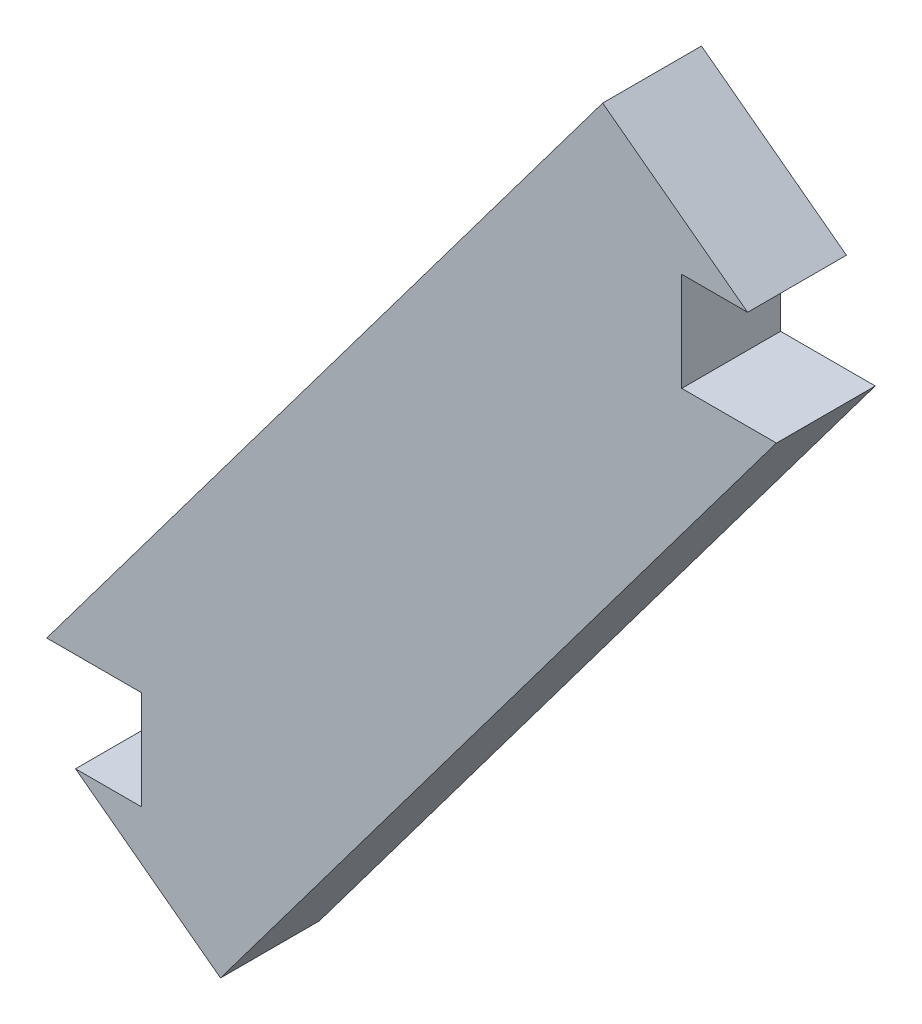
ISO-10303-21;
HEADER;
FILE_DESCRIPTION(('STEP AP214'),'2;1');
FILE_NAME('part.step','',(''),(''),'','','');
FILE_SCHEMA(('AUTOMOTIVE_DESIGN { 1 0 10303 214 1 1 1 1 }'));
ENDSEC;
DATA;
#1=APPLICATION_CONTEXT('core data for automotive mechanical design processes');
#2=APPLICATION_PROTOCOL_DEFINITION('international standard','automotive_design',2000,#1);
#3=PRODUCT_CONTEXT('',#1,'mechanical');
#4=PRODUCT('Part','Part','',(#3));
#5=PRODUCT_RELATED_PRODUCT_CATEGORY('part','',(#4));
#6=PRODUCT_DEFINITION_FORMATION('','',#4);
#7=PRODUCT_DEFINITION_CONTEXT('part definition',#1,'design');
#8=PRODUCT_DEFINITION('design','',#6,#7);
#9=PRODUCT_DEFINITION_SHAPE('','',#8);
#10=(LENGTH_UNIT() NAMED_UNIT(*) SI_UNIT(.MILLI.,.METRE.));
#11=(NAMED_UNIT(*) PLANE_ANGLE_UNIT() SI_UNIT($,.RADIAN.));
#12=(NAMED_UNIT(*) SI_UNIT($,.STERADIAN.) SOLID_ANGLE_UNIT());
#13=UNCERTAINTY_MEASURE_WITH_UNIT(LENGTH_MEASURE(1.E-05),#10,'distance_accuracy_value','');
#14=(GEOMETRIC_REPRESENTATION_CONTEXT(3) GLOBAL_UNCERTAINTY_ASSIGNED_CONTEXT((#13)) GLOBAL_UNIT_ASSIGNED_CONTEXT((#10,
#11,#12)) REPRESENTATION_CONTEXT('',''));
#15=CARTESIAN_POINT('',(0.,0.,0.));
#16=DIRECTION('',(0.,0.,1.));
#17=DIRECTION('',(1.,0.,0.));
#18=AXIS2_PLACEMENT_3D('',#15,#16,#17);
#19=CARTESIAN_POINT('',(32.385,0.,4.7625));
#20=DIRECTION('',(-1.,0.,0.));
#21=DIRECTION('',(0.,0.,1.));
#22=AXIS2_PLACEMENT_3D('',#19,#20,#21);
#23=PLANE('',#22);
#24=DIRECTION('',(0.,1.,0.));
#25=VECTOR('',#24,1.);
#26=CARTESIAN_POINT('',(32.385,0.,0.));
#27=LINE('',#26,#25);
#28=CARTESIAN_POINT('',(32.385,28.09875,0.));
#29=VERTEX_POINT('',#28);
#30=CARTESIAN_POINT('',(32.385,32.86125,0.));
#31=VERTEX_POINT('',#30);
#32=EDGE_CURVE('E144',#29,#31,#27,.T.);
#33=ORIENTED_EDGE('',*,*,#32,.T.);
#34=DIRECTION('',(0.,0.,-1.));
#35=VECTOR('',#34,1.);
#36=CARTESIAN_POINT('',(32.385,32.86125,4.7625));
#37=LINE('',#36,#35);
#38=CARTESIAN_POINT('',(32.385,32.86125,4.7625));
#39=VERTEX_POINT('',#38);
#40=EDGE_CURVE('E11',#39,#31,#37,.T.);
#41=ORIENTED_EDGE('',*,*,#40,.F.);
#42=DIRECTION('',(0.,1.,0.));
#43=VECTOR('',#42,1.);
#44=CARTESIAN_POINT('',(32.385,0.,4.7625));
#45=LINE('',#44,#43);
#46=CARTESIAN_POINT('',(32.385,28.09875,4.7625));
#47=VERTEX_POINT('',#46);
#48=EDGE_CURVE('E168',#47,#39,#45,.T.);
#49=ORIENTED_EDGE('',*,*,#48,.F.);
#50=DIRECTION('',(0.,0.,-1.));
#51=VECTOR('',#50,1.);
#52=CARTESIAN_POINT('',(32.385,28.09875,4.7625));
#53=LINE('',#52,#51);
#54=EDGE_CURVE('E140',#47,#29,#53,.T.);
#55=ORIENTED_EDGE('',*,*,#54,.T.);
#56=EDGE_LOOP('',(#33,#41,#49,#55));
#57=FACE_BOUND('',#56,.T.);
#58=ADVANCED_FACE('F36',(#57),#23,.F.);
#59=CARTESIAN_POINT('',(0.,32.86125,4.7625));
#60=DIRECTION('',(0.,1.,0.));
#61=DIRECTION('',(0.,0.,1.));
#62=AXIS2_PLACEMENT_3D('',#59,#60,#61);
#63=PLANE('',#62);
#64=DIRECTION('',(1.,0.,0.));
#65=VECTOR('',#64,1.);
#66=CARTESIAN_POINT('',(0.,32.86125,0.));
#67=LINE('',#66,#65);
#68=CARTESIAN_POINT('',(35.56,32.86125,0.));
#69=VERTEX_POINT('',#68);
#70=EDGE_CURVE('E147',#31,#69,#67,.T.);
#71=ORIENTED_EDGE('',*,*,#70,.T.);
#72=DIRECTION('',(0.,0.,-1.));
#73=VECTOR('',#72,1.);
#74=CARTESIAN_POINT('',(35.56,32.86125,4.7625));
#75=LINE('',#74,#73);
#76=CARTESIAN_POINT('',(35.56,32.86125,4.7625));
#77=VERTEX_POINT('',#76);
#78=EDGE_CURVE('E44',#77,#69,#75,.T.);
#79=ORIENTED_EDGE('',*,*,#78,.F.);
#80=DIRECTION('',(1.,0.,0.));
#81=VECTOR('',#80,1.);
#82=CARTESIAN_POINT('',(0.,32.86125,4.7625));
#83=LINE('',#82,#81);
#84=EDGE_CURVE('E101',#39,#77,#83,.T.);
#85=ORIENTED_EDGE('',*,*,#84,.F.);
#86=ORIENTED_EDGE('',*,*,#40,.T.);
#87=EDGE_LOOP('',(#71,#79,#85,#86));
#88=FACE_BOUND('',#87,.T.);
#89=ADVANCED_FACE('F185',(#88),#63,.F.);
#90=CARTESIAN_POINT('',(28.575,38.1,4.7625));
#91=DIRECTION('',(0.6,0.8,0.));
#92=DIRECTION('',(-0.8,0.6,0.));
#93=AXIS2_PLACEMENT_3D('',#90,#91,#92);
#94=PLANE('',#93);
#95=DIRECTION('',(0.8,-0.6,0.));
#96=VECTOR('',#95,1.);
#97=CARTESIAN_POINT('',(28.575,38.1,0.));
#98=LINE('',#97,#96);
#99=CARTESIAN_POINT('',(28.575,38.1,0.));
#100=VERTEX_POINT('',#99);
#101=EDGE_CURVE('E150',#100,#69,#98,.T.);
#102=ORIENTED_EDGE('',*,*,#101,.F.);
#103=DIRECTION('',(0.,0.,-1.));
#104=VECTOR('',#103,1.);
#105=CARTESIAN_POINT('',(28.575,38.1,4.7625));
#106=LINE('',#105,#104);
#107=CARTESIAN_POINT('',(28.575,38.1,4.7625));
#108=VERTEX_POINT('',#107);
#109=EDGE_CURVE('E178',#108,#100,#106,.T.);
#110=ORIENTED_EDGE('',*,*,#109,.F.);
#111=DIRECTION('',(0.8,-0.6,0.));
#112=VECTOR('',#111,1.);
#113=CARTESIAN_POINT('',(28.575,38.1,4.7625));
#114=LINE('',#113,#112);
#115=EDGE_CURVE('E184',#108,#77,#114,.T.);
#116=ORIENTED_EDGE('',*,*,#115,.T.);
#117=ORIENTED_EDGE('',*,*,#78,.T.);
#118=EDGE_LOOP('',(#102,#110,#116,#117));
#119=FACE_BOUND('',#118,.T.);
#120=ADVANCED_FACE('F182',(#119),#94,.T.);
#121=CARTESIAN_POINT('',(0.,0.,4.7625));
#122=DIRECTION('',(-0.8,0.6,0.));
#123=DIRECTION('',(-0.6,-0.8,0.));
#124=AXIS2_PLACEMENT_3D('',#121,#122,#123);
#125=PLANE('',#124);
#126=DIRECTION('',(0.6,0.8,0.));
#127=VECTOR('',#126,1.);
#128=CARTESIAN_POINT('',(0.,0.,0.));
#129=LINE('',#128,#127);
#130=CARTESIAN_POINT('',(1.7859375,2.38125,0.));
#131=VERTEX_POINT('',#130);
#132=EDGE_CURVE('E153',#131,#100,#129,.T.);
#133=ORIENTED_EDGE('',*,*,#132,.F.);
#134=DIRECTION('',(0.,0.,-1.));
#135=VECTOR('',#134,1.);
#136=CARTESIAN_POINT('',(1.7859375,2.38125,4.7625));
#137=LINE('',#136,#135);
#138=CARTESIAN_POINT('',(1.7859375,2.38125,4.7625));
#139=VERTEX_POINT('',#138);
#140=EDGE_CURVE('E176',#139,#131,#137,.T.);
#141=ORIENTED_EDGE('',*,*,#140,.F.);
#142=DIRECTION('',(0.6,0.8,0.));
#143=VECTOR('',#142,1.);
#144=CARTESIAN_POINT('',(0.,0.,4.7625));
#145=LINE('',#144,#143);
#146=EDGE_CURVE('E196',#139,#108,#145,.T.);
#147=ORIENTED_EDGE('',*,*,#146,.T.);
#148=ORIENTED_EDGE('',*,*,#109,.T.);
#149=EDGE_LOOP('',(#133,#141,#147,#148));
#150=FACE_BOUND('',#149,.T.);
#151=ADVANCED_FACE('F193',(#150),#125,.T.);
#152=CARTESIAN_POINT('',(0.,2.38125,4.7625));
#153=DIRECTION('',(0.,-1.,0.));
#154=DIRECTION('',(1.,0.,0.));
#155=AXIS2_PLACEMENT_3D('',#152,#153,#154);
#156=PLANE('',#155);
#157=DIRECTION('',(-1.,0.,0.));
#158=VECTOR('',#157,1.);
#159=CARTESIAN_POINT('',(0.,2.38125,0.));
#160=LINE('',#159,#158);
#161=CARTESIAN_POINT('',(6.35,2.38125,0.));
#162=VERTEX_POINT('',#161);
#163=EDGE_CURVE('E156',#162,#131,#160,.T.);
#164=ORIENTED_EDGE('',*,*,#163,.F.);
#165=DIRECTION('',(0.,0.,-1.));
#166=VECTOR('',#165,1.);
#167=CARTESIAN_POINT('',(6.35,2.38125,4.7625));
#168=LINE('',#167,#166);
#169=CARTESIAN_POINT('',(6.35,2.38125,4.7625));
#170=VERTEX_POINT('',#169);
#171=EDGE_CURVE('E174',#170,#162,#168,.T.);
#172=ORIENTED_EDGE('',*,*,#171,.F.);
#173=DIRECTION('',(-1.,0.,0.));
#174=VECTOR('',#173,1.);
#175=CARTESIAN_POINT('',(0.,2.38125,4.7625));
#176=LINE('',#175,#174);
#177=EDGE_CURVE('E200',#170,#139,#176,.T.);
#178=ORIENTED_EDGE('',*,*,#177,.T.);
#179=ORIENTED_EDGE('',*,*,#140,.T.);
#180=EDGE_LOOP('',(#164,#172,#178,#179));
#181=FACE_BOUND('',#180,.T.);
#182=ADVANCED_FACE('F235',(#181),#156,.T.);
#183=CARTESIAN_POINT('',(6.35,0.,4.7625));
#184=DIRECTION('',(-1.,0.,0.));
#185=DIRECTION('',(0.,0.,1.));
#186=AXIS2_PLACEMENT_3D('',#183,#184,#185);
#187=PLANE('',#186);
#188=DIRECTION('',(0.,1.,0.));
#189=VECTOR('',#188,1.);
#190=CARTESIAN_POINT('',(6.35,0.,0.));
#191=LINE('',#190,#189);
#192=CARTESIAN_POINT('',(6.35,-2.38125,0.));
#193=VERTEX_POINT('',#192);
#194=EDGE_CURVE('E159',#193,#162,#191,.T.);
#195=ORIENTED_EDGE('',*,*,#194,.F.);
#196=DIRECTION('',(0.,0.,-1.));
#197=VECTOR('',#196,1.);
#198=CARTESIAN_POINT('',(6.35,-2.38125,4.7625));
#199=LINE('',#198,#197);
#200=CARTESIAN_POINT('',(6.35,-2.38125,4.7625));
#201=VERTEX_POINT('',#200);
#202=EDGE_CURVE('E172',#201,#193,#199,.T.);
#203=ORIENTED_EDGE('',*,*,#202,.F.);
#204=DIRECTION('',(0.,1.,0.));
#205=VECTOR('',#204,1.);
#206=CARTESIAN_POINT('',(6.35,0.,4.7625));
#207=LINE('',#206,#205);
#208=EDGE_CURVE('E206',#201,#170,#207,.T.);
#209=ORIENTED_EDGE('',*,*,#208,.T.);
#210=ORIENTED_EDGE('',*,*,#171,.T.);
#211=EDGE_LOOP('',(#195,#203,#209,#210));
#212=FACE_BOUND('',#211,.T.);
#213=ADVANCED_FACE('F238',(#212),#187,.T.);
#214=CARTESIAN_POINT('',(0.,-2.38125,4.7625));
#215=DIRECTION('',(0.,1.,0.));
#216=DIRECTION('',(0.,0.,1.));
#217=AXIS2_PLACEMENT_3D('',#214,#215,#216);
#218=PLANE('',#217);
#219=DIRECTION('',(1.,0.,0.));
#220=VECTOR('',#219,1.);
#221=CARTESIAN_POINT('',(0.,-2.38125,0.));
#222=LINE('',#221,#220);
#223=CARTESIAN_POINT('',(3.175,-2.38125,0.));
#224=VERTEX_POINT('',#223);
#225=EDGE_CURVE('E162',#224,#193,#222,.T.);
#226=ORIENTED_EDGE('',*,*,#225,.F.);
#227=DIRECTION('',(0.,0.,-1.));
#228=VECTOR('',#227,1.);
#229=CARTESIAN_POINT('',(3.175,-2.38125,4.7625));
#230=LINE('',#229,#228);
#231=CARTESIAN_POINT('',(3.175,-2.38125,4.7625));
#232=VERTEX_POINT('',#231);
#233=EDGE_CURVE('E135',#232,#224,#230,.T.);
#234=ORIENTED_EDGE('',*,*,#233,.F.);
#235=DIRECTION('',(1.,0.,0.));
#236=VECTOR('',#235,1.);
#237=CARTESIAN_POINT('',(0.,-2.38125,4.7625));
#238=LINE('',#237,#236);
#239=EDGE_CURVE('E128',#232,#201,#238,.T.);
#240=ORIENTED_EDGE('',*,*,#239,.T.);
#241=ORIENTED_EDGE('',*,*,#202,.T.);
#242=EDGE_LOOP('',(#226,#234,#240,#241));
#243=FACE_BOUND('',#242,.T.);
#244=ADVANCED_FACE('F210',(#243),#218,.T.);
#245=CARTESIAN_POINT('',(0.,0.,4.7625));
#246=DIRECTION('',(0.6,0.8,0.));
#247=DIRECTION('',(-0.8,0.6,0.));
#248=AXIS2_PLACEMENT_3D('',#245,#246,#247);
#249=PLANE('',#248);
#250=DIRECTION('',(0.8,-0.6,0.));
#251=VECTOR('',#250,1.);
#252=CARTESIAN_POINT('',(0.,0.,0.));
#253=LINE('',#252,#251);
#254=CARTESIAN_POINT('',(10.16,-7.62,0.));
#255=VERTEX_POINT('',#254);
#256=EDGE_CURVE('E134',#224,#255,#253,.T.);
#257=ORIENTED_EDGE('',*,*,#256,.T.);
#258=DIRECTION('',(0.,0.,-1.));
#259=VECTOR('',#258,1.);
#260=CARTESIAN_POINT('',(10.16,-7.62,4.7625));
#261=LINE('',#260,#259);
#262=CARTESIAN_POINT('',(10.16,-7.62,4.7625));
#263=VERTEX_POINT('',#262);
#264=EDGE_CURVE('E131',#263,#255,#261,.T.);
#265=ORIENTED_EDGE('',*,*,#264,.F.);
#266=DIRECTION('',(0.8,-0.6,0.));
#267=VECTOR('',#266,1.);
#268=CARTESIAN_POINT('',(0.,0.,4.7625));
#269=LINE('',#268,#267);
#270=EDGE_CURVE('E121',#232,#263,#269,.T.);
#271=ORIENTED_EDGE('',*,*,#270,.F.);
#272=ORIENTED_EDGE('',*,*,#233,.T.);
#273=EDGE_LOOP('',(#257,#265,#271,#272));
#274=FACE_BOUND('',#273,.T.);
#275=ADVANCED_FACE('F132',(#274),#249,.F.);
#276=CARTESIAN_POINT('',(10.16,-7.62,4.7625));
#277=DIRECTION('',(-0.8,0.6,0.));
#278=DIRECTION('',(-0.6,-0.8,0.));
#279=AXIS2_PLACEMENT_3D('',#276,#277,#278);
#280=PLANE('',#279);
#281=DIRECTION('',(0.6,0.8,0.));
#282=VECTOR('',#281,1.);
#283=CARTESIAN_POINT('',(10.16,-7.62,0.));
#284=LINE('',#283,#282);
#285=CARTESIAN_POINT('',(36.9490625,28.09875,0.));
#286=VERTEX_POINT('',#285);
#287=EDGE_CURVE('E87',#255,#286,#284,.T.);
#288=ORIENTED_EDGE('',*,*,#287,.T.);
#289=DIRECTION('',(0.,0.,-1.));
#290=VECTOR('',#289,1.);
#291=CARTESIAN_POINT('',(36.9490625,28.09875,4.7625));
#292=LINE('',#291,#290);
#293=CARTESIAN_POINT('',(36.9490625,28.09875,4.7625));
#294=VERTEX_POINT('',#293);
#295=EDGE_CURVE('E136',#294,#286,#292,.T.);
#296=ORIENTED_EDGE('',*,*,#295,.F.);
#297=DIRECTION('',(0.6,0.8,0.));
#298=VECTOR('',#297,1.);
#299=CARTESIAN_POINT('',(10.16,-7.62,4.7625));
#300=LINE('',#299,#298);
#301=EDGE_CURVE('E125',#263,#294,#300,.T.);
#302=ORIENTED_EDGE('',*,*,#301,.F.);
#303=ORIENTED_EDGE('',*,*,#264,.T.);
#304=EDGE_LOOP('',(#288,#296,#302,#303));
#305=FACE_BOUND('',#304,.T.);
#306=ADVANCED_FACE('F138',(#305),#280,.F.);
#307=CARTESIAN_POINT('',(0.,28.09875,4.7625));
#308=DIRECTION('',(0.,-1.,0.));
#309=DIRECTION('',(0.,0.,-1.));
#310=AXIS2_PLACEMENT_3D('',#307,#308,#309);
#311=PLANE('',#310);
#312=DIRECTION('',(-1.,0.,0.));
#313=VECTOR('',#312,1.);
#314=CARTESIAN_POINT('',(0.,28.09875,0.));
#315=LINE('',#314,#313);
#316=EDGE_CURVE('E93',#286,#29,#315,.T.);
#317=ORIENTED_EDGE('',*,*,#316,.T.);
#318=ORIENTED_EDGE('',*,*,#54,.F.);
#319=DIRECTION('',(-1.,0.,0.));
#320=VECTOR('',#319,1.);
#321=CARTESIAN_POINT('',(0.,28.09875,4.7625));
#322=LINE('',#321,#320);
#323=EDGE_CURVE('E52',#294,#47,#322,.T.);
#324=ORIENTED_EDGE('',*,*,#323,.F.);
#325=ORIENTED_EDGE('',*,*,#295,.T.);
#326=EDGE_LOOP('',(#317,#318,#324,#325));
#327=FACE_BOUND('',#326,.T.);
#328=ADVANCED_FACE('F214',(#327),#311,.F.);
#329=CARTESIAN_POINT('',(0.,0.,4.7625));
#330=DIRECTION('',(0.,0.,1.));
#331=DIRECTION('',(1.,0.,0.));
#332=AXIS2_PLACEMENT_3D('',#329,#330,#331);
#333=PLANE('',#332);
#334=ORIENTED_EDGE('',*,*,#48,.T.);
#335=ORIENTED_EDGE('',*,*,#84,.T.);
#336=ORIENTED_EDGE('',*,*,#115,.F.);
#337=ORIENTED_EDGE('',*,*,#146,.F.);
#338=ORIENTED_EDGE('',*,*,#177,.F.);
#339=ORIENTED_EDGE('',*,*,#208,.F.);
#340=ORIENTED_EDGE('',*,*,#239,.F.);
#341=ORIENTED_EDGE('',*,*,#270,.T.);
#342=ORIENTED_EDGE('',*,*,#301,.T.);
#343=ORIENTED_EDGE('',*,*,#323,.T.);
#344=EDGE_LOOP('',(#334,#335,#336,#337,#338,#339,#340,#341,#342,#343));
#345=FACE_BOUND('',#344,.T.);
#346=ADVANCED_FACE('F123',(#345),#333,.T.);
#347=CARTESIAN_POINT('',(0.,0.,0.));
#348=DIRECTION('',(0.,0.,1.));
#349=DIRECTION('',(1.,0.,0.));
#350=AXIS2_PLACEMENT_3D('',#347,#348,#349);
#351=PLANE('',#350);
#352=ORIENTED_EDGE('',*,*,#32,.F.);
#353=ORIENTED_EDGE('',*,*,#316,.F.);
#354=ORIENTED_EDGE('',*,*,#287,.F.);
#355=ORIENTED_EDGE('',*,*,#256,.F.);
#356=ORIENTED_EDGE('',*,*,#225,.T.);
#357=ORIENTED_EDGE('',*,*,#194,.T.);
#358=ORIENTED_EDGE('',*,*,#163,.T.);
#359=ORIENTED_EDGE('',*,*,#132,.T.);
#360=ORIENTED_EDGE('',*,*,#101,.T.);
#361=ORIENTED_EDGE('',*,*,#70,.F.);
#362=EDGE_LOOP('',(#352,#353,#354,#355,#356,#357,#358,#359,#360,#361));
#363=FACE_BOUND('',#362,.T.);
#364=ADVANCED_FACE('F189',(#363),#351,.F.);
#365=CLOSED_SHELL('',(#58,#89,#120,#151,#182,#213,#244,#275,#306,#328,#346,#364));
#366=MANIFOLD_SOLID_BREP('B2',#365);
#367=ADVANCED_BREP_SHAPE_REPRESENTATION('',(#18,#366),#14);
#368=SHAPE_DEFINITION_REPRESENTATION(#9,#367);
ENDSEC;
END-ISO-10303-21;
